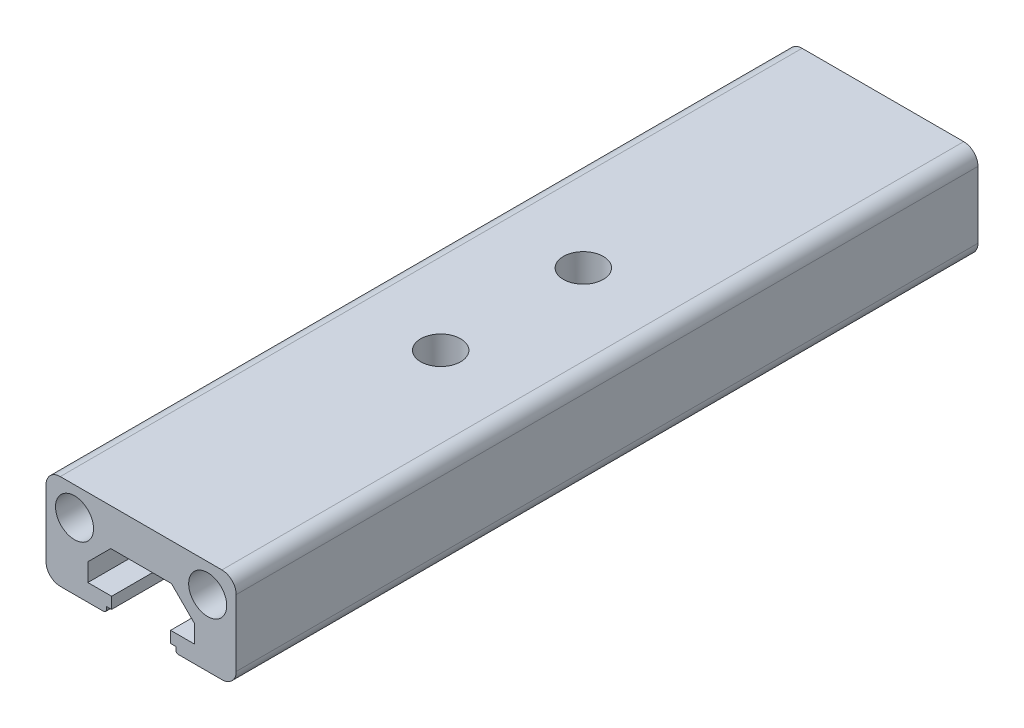
ISO-10303-21;
HEADER;
FILE_DESCRIPTION(('STEP AP214'),'2;1');
FILE_NAME('part.step','',(''),(''),'','','');
FILE_SCHEMA(('AUTOMOTIVE_DESIGN { 1 0 10303 214 1 1 1 1 }'));
ENDSEC;
DATA;
#1=APPLICATION_CONTEXT('core data for automotive mechanical design processes');
#2=APPLICATION_PROTOCOL_DEFINITION('international standard','automotive_design',2000,#1);
#3=PRODUCT_CONTEXT('',#1,'mechanical');
#4=PRODUCT('Part','Part','',(#3));
#5=PRODUCT_RELATED_PRODUCT_CATEGORY('part','',(#4));
#6=PRODUCT_DEFINITION_FORMATION('','',#4);
#7=PRODUCT_DEFINITION_CONTEXT('part definition',#1,'design');
#8=PRODUCT_DEFINITION('design','',#6,#7);
#9=PRODUCT_DEFINITION_SHAPE('','',#8);
#10=(LENGTH_UNIT() NAMED_UNIT(*) SI_UNIT(.MILLI.,.METRE.));
#11=(NAMED_UNIT(*) PLANE_ANGLE_UNIT() SI_UNIT($,.RADIAN.));
#12=(NAMED_UNIT(*) SI_UNIT($,.STERADIAN.) SOLID_ANGLE_UNIT());
#13=UNCERTAINTY_MEASURE_WITH_UNIT(LENGTH_MEASURE(1.E-05),#10,'distance_accuracy_value','');
#14=(GEOMETRIC_REPRESENTATION_CONTEXT(3) GLOBAL_UNCERTAINTY_ASSIGNED_CONTEXT((#13)) GLOBAL_UNIT_ASSIGNED_CONTEXT((#10,
#11,#12)) REPRESENTATION_CONTEXT('',''));
#15=CARTESIAN_POINT('',(0.,0.,0.));
#16=DIRECTION('',(0.,0.,1.));
#17=DIRECTION('',(1.,0.,0.));
#18=AXIS2_PLACEMENT_3D('',#15,#16,#17);
#19=CARTESIAN_POINT('',(3.95,0.3,39.));
#20=DIRECTION('',(0.,0.,1.));
#21=DIRECTION('',(1.,0.,0.));
#22=AXIS2_PLACEMENT_3D('',#19,#20,#21);
#23=PLANE('',#22);
#24=CARTESIAN_POINT('',(-7.,7.,39.));
#25=DIRECTION('',(0.,0.,1.));
#26=DIRECTION('',(1.,0.,0.));
#27=AXIS2_PLACEMENT_3D('',#24,#25,#26);
#28=CIRCLE('',#27,2.);
#29=CARTESIAN_POINT('',(-5.,7.,39.));
#30=VERTEX_POINT('',#29);
#31=EDGE_CURVE('E236',#30,#30,#28,.T.);
#32=ORIENTED_EDGE('',*,*,#31,.F.);
#33=EDGE_LOOP('',(#32));
#34=FACE_BOUND('',#33,.T.);
#35=DIRECTION('',(1.,0.,0.));
#36=VECTOR('',#35,1.);
#37=CARTESIAN_POINT('',(-3.65,0.6,39.));
#38=LINE('',#37,#36);
#39=CARTESIAN_POINT('',(-3.65,0.6,39.));
#40=VERTEX_POINT('',#39);
#41=CARTESIAN_POINT('',(-3.1,0.6,39.));
#42=VERTEX_POINT('',#41);
#43=EDGE_CURVE('E279',#40,#42,#38,.T.);
#44=ORIENTED_EDGE('',*,*,#43,.T.);
#45=DIRECTION('',(0.,1.,0.));
#46=VECTOR('',#45,1.);
#47=CARTESIAN_POINT('',(-3.1,0.6,39.));
#48=LINE('',#47,#46);
#49=CARTESIAN_POINT('',(-3.1,1.8,39.));
#50=VERTEX_POINT('',#49);
#51=EDGE_CURVE('E147',#42,#50,#48,.T.);
#52=ORIENTED_EDGE('',*,*,#51,.T.);
#53=DIRECTION('',(-1.,0.,0.));
#54=VECTOR('',#53,1.);
#55=CARTESIAN_POINT('',(-3.1,1.8,39.));
#56=LINE('',#55,#54);
#57=CARTESIAN_POINT('',(-5.6,1.8,39.));
#58=VERTEX_POINT('',#57);
#59=EDGE_CURVE('E365',#50,#58,#56,.T.);
#60=ORIENTED_EDGE('',*,*,#59,.T.);
#61=DIRECTION('',(0.,1.,0.));
#62=VECTOR('',#61,1.);
#63=CARTESIAN_POINT('',(-5.6,1.8,39.));
#64=LINE('',#63,#62);
#65=CARTESIAN_POINT('',(-5.6,3.69289321881342,39.));
#66=VERTEX_POINT('',#65);
#67=EDGE_CURVE('E367',#58,#66,#64,.T.);
#68=ORIENTED_EDGE('',*,*,#67,.T.);
#69=DIRECTION('',(0.707106781186543,0.707106781186552,0.));
#70=VECTOR('',#69,1.);
#71=CARTESIAN_POINT('',(-5.6,3.69289321881342,39.));
#72=LINE('',#71,#70);
#73=CARTESIAN_POINT('',(-3.19289321881345,6.1,39.));
#74=VERTEX_POINT('',#73);
#75=EDGE_CURVE('E369',#66,#74,#72,.T.);
#76=ORIENTED_EDGE('',*,*,#75,.T.);
#77=DIRECTION('',(1.,0.,0.));
#78=VECTOR('',#77,1.);
#79=CARTESIAN_POINT('',(-3.19289321881345,6.1,39.));
#80=LINE('',#79,#78);
#81=CARTESIAN_POINT('',(3.19289321881345,6.1,39.));
#82=VERTEX_POINT('',#81);
#83=EDGE_CURVE('E371',#74,#82,#80,.T.);
#84=ORIENTED_EDGE('',*,*,#83,.T.);
#85=DIRECTION('',(0.707106781186544,-0.707106781186551,0.));
#86=VECTOR('',#85,1.);
#87=CARTESIAN_POINT('',(5.6,3.69289321881343,39.));
#88=LINE('',#87,#86);
#89=CARTESIAN_POINT('',(5.6,3.69289321881343,39.));
#90=VERTEX_POINT('',#89);
#91=EDGE_CURVE('E373',#82,#90,#88,.T.);
#92=ORIENTED_EDGE('',*,*,#91,.T.);
#93=DIRECTION('',(0.,-1.,0.));
#94=VECTOR('',#93,1.);
#95=CARTESIAN_POINT('',(5.6,1.8,39.));
#96=LINE('',#95,#94);
#97=CARTESIAN_POINT('',(5.6,1.8,39.));
#98=VERTEX_POINT('',#97);
#99=EDGE_CURVE('E375',#90,#98,#96,.T.);
#100=ORIENTED_EDGE('',*,*,#99,.T.);
#101=DIRECTION('',(-1.,0.,0.));
#102=VECTOR('',#101,1.);
#103=CARTESIAN_POINT('',(3.1,1.8,39.));
#104=LINE('',#103,#102);
#105=CARTESIAN_POINT('',(3.1,1.8,39.));
#106=VERTEX_POINT('',#105);
#107=EDGE_CURVE('E377',#98,#106,#104,.T.);
#108=ORIENTED_EDGE('',*,*,#107,.T.);
#109=DIRECTION('',(0.,-1.,0.));
#110=VECTOR('',#109,1.);
#111=CARTESIAN_POINT('',(3.1,0.6,39.));
#112=LINE('',#111,#110);
#113=CARTESIAN_POINT('',(3.1,0.6,39.));
#114=VERTEX_POINT('',#113);
#115=EDGE_CURVE('E379',#106,#114,#112,.T.);
#116=ORIENTED_EDGE('',*,*,#115,.T.);
#117=DIRECTION('',(1.,0.,0.));
#118=VECTOR('',#117,1.);
#119=CARTESIAN_POINT('',(3.65,0.6,39.));
#120=LINE('',#119,#118);
#121=CARTESIAN_POINT('',(3.65,0.6,39.));
#122=VERTEX_POINT('',#121);
#123=EDGE_CURVE('E381',#114,#122,#120,.T.);
#124=ORIENTED_EDGE('',*,*,#123,.T.);
#125=DIRECTION('',(0.,-1.,0.));
#126=VECTOR('',#125,1.);
#127=CARTESIAN_POINT('',(3.65,0.300000000000002,39.));
#128=LINE('',#127,#126);
#129=CARTESIAN_POINT('',(3.65,0.300000000000002,39.));
#130=VERTEX_POINT('',#129);
#131=EDGE_CURVE('E383',#122,#130,#128,.T.);
#132=ORIENTED_EDGE('',*,*,#131,.T.);
#133=CARTESIAN_POINT('',(3.95,0.3,39.));
#134=DIRECTION('',(0.,0.,1.));
#135=DIRECTION('',(1.,0.,0.));
#136=AXIS2_PLACEMENT_3D('',#133,#134,#135);
#137=CIRCLE('',#136,0.3);
#138=CARTESIAN_POINT('',(3.95,0.,39.));
#139=VERTEX_POINT('',#138);
#140=EDGE_CURVE('E385',#130,#139,#137,.T.);
#141=ORIENTED_EDGE('',*,*,#140,.T.);
#142=DIRECTION('',(1.,0.,0.));
#143=VECTOR('',#142,1.);
#144=CARTESIAN_POINT('',(8.49999999999999,0.,39.));
#145=LINE('',#144,#143);
#146=CARTESIAN_POINT('',(8.49999999999999,0.,39.));
#147=VERTEX_POINT('',#146);
#148=EDGE_CURVE('E387',#139,#147,#145,.T.);
#149=ORIENTED_EDGE('',*,*,#148,.T.);
#150=CARTESIAN_POINT('',(8.5,1.5,39.));
#151=DIRECTION('',(0.,0.,1.));
#152=DIRECTION('',(1.,0.,0.));
#153=AXIS2_PLACEMENT_3D('',#150,#151,#152);
#154=CIRCLE('',#153,1.5);
#155=CARTESIAN_POINT('',(10.,1.50000000000001,39.));
#156=VERTEX_POINT('',#155);
#157=EDGE_CURVE('E389',#147,#156,#154,.T.);
#158=ORIENTED_EDGE('',*,*,#157,.T.);
#159=DIRECTION('',(0.,1.,0.));
#160=VECTOR('',#159,1.);
#161=CARTESIAN_POINT('',(10.,8.49999999999999,39.));
#162=LINE('',#161,#160);
#163=CARTESIAN_POINT('',(10.,8.49999999999999,39.));
#164=VERTEX_POINT('',#163);
#165=EDGE_CURVE('E391',#156,#164,#162,.T.);
#166=ORIENTED_EDGE('',*,*,#165,.T.);
#167=CARTESIAN_POINT('',(8.5,8.5,39.));
#168=DIRECTION('',(0.,0.,1.));
#169=DIRECTION('',(-1.,0.,0.));
#170=AXIS2_PLACEMENT_3D('',#167,#168,#169);
#171=CIRCLE('',#170,1.5);
#172=CARTESIAN_POINT('',(8.49999999999999,10.,39.));
#173=VERTEX_POINT('',#172);
#174=EDGE_CURVE('E393',#164,#173,#171,.T.);
#175=ORIENTED_EDGE('',*,*,#174,.T.);
#176=DIRECTION('',(-1.,0.,0.));
#177=VECTOR('',#176,1.);
#178=CARTESIAN_POINT('',(8.49999999999999,10.,39.));
#179=LINE('',#178,#177);
#180=CARTESIAN_POINT('',(-8.49999999999999,10.,39.));
#181=VERTEX_POINT('',#180);
#182=EDGE_CURVE('E395',#173,#181,#179,.T.);
#183=ORIENTED_EDGE('',*,*,#182,.T.);
#184=CARTESIAN_POINT('',(-8.5,8.5,39.));
#185=DIRECTION('',(0.,0.,1.));
#186=DIRECTION('',(1.,0.,0.));
#187=AXIS2_PLACEMENT_3D('',#184,#185,#186);
#188=CIRCLE('',#187,1.5);
#189=CARTESIAN_POINT('',(-10.,8.49999999999999,39.));
#190=VERTEX_POINT('',#189);
#191=EDGE_CURVE('E397',#181,#190,#188,.T.);
#192=ORIENTED_EDGE('',*,*,#191,.T.);
#193=DIRECTION('',(0.,-1.,0.));
#194=VECTOR('',#193,1.);
#195=CARTESIAN_POINT('',(-10.,8.49999999999999,39.));
#196=LINE('',#195,#194);
#197=CARTESIAN_POINT('',(-10.,1.5,39.));
#198=VERTEX_POINT('',#197);
#199=EDGE_CURVE('E399',#190,#198,#196,.T.);
#200=ORIENTED_EDGE('',*,*,#199,.T.);
#201=CARTESIAN_POINT('',(-8.5,1.5,39.));
#202=DIRECTION('',(0.,0.,1.));
#203=DIRECTION('',(-1.,0.,0.));
#204=AXIS2_PLACEMENT_3D('',#201,#202,#203);
#205=CIRCLE('',#204,1.5);
#206=CARTESIAN_POINT('',(-8.49999999999999,0.,39.));
#207=VERTEX_POINT('',#206);
#208=EDGE_CURVE('E214',#198,#207,#205,.T.);
#209=ORIENTED_EDGE('',*,*,#208,.T.);
#210=DIRECTION('',(1.,0.,0.));
#211=VECTOR('',#210,1.);
#212=CARTESIAN_POINT('',(-8.49999999999999,0.,39.));
#213=LINE('',#212,#211);
#214=CARTESIAN_POINT('',(-3.95,0.,39.));
#215=VERTEX_POINT('',#214);
#216=EDGE_CURVE('E208',#207,#215,#213,.T.);
#217=ORIENTED_EDGE('',*,*,#216,.T.);
#218=CARTESIAN_POINT('',(-3.95,0.3,39.));
#219=DIRECTION('',(0.,0.,1.));
#220=DIRECTION('',(1.,0.,0.));
#221=AXIS2_PLACEMENT_3D('',#218,#219,#220);
#222=CIRCLE('',#221,0.3);
#223=CARTESIAN_POINT('',(-3.65,0.300000000000002,39.));
#224=VERTEX_POINT('',#223);
#225=EDGE_CURVE('E212',#215,#224,#222,.T.);
#226=ORIENTED_EDGE('',*,*,#225,.T.);
#227=DIRECTION('',(0.,1.,0.));
#228=VECTOR('',#227,1.);
#229=CARTESIAN_POINT('',(-3.65,0.300000000000002,39.));
#230=LINE('',#229,#228);
#231=EDGE_CURVE('E56',#224,#40,#230,.T.);
#232=ORIENTED_EDGE('',*,*,#231,.T.);
#233=EDGE_LOOP('',(#44,#52,#60,#68,#76,#84,#92,#100,#108,#116,#124,#132,#141,#149,#158,#166,
#175,#183,#192,#200,#209,#217,#226,#232));
#234=FACE_BOUND('',#233,.T.);
#235=CARTESIAN_POINT('',(7.,7.,39.));
#236=DIRECTION('',(0.,0.,1.));
#237=DIRECTION('',(-1.,0.,0.));
#238=AXIS2_PLACEMENT_3D('',#235,#236,#237);
#239=CIRCLE('',#238,2.);
#240=CARTESIAN_POINT('',(5.,7.,39.));
#241=VERTEX_POINT('',#240);
#242=EDGE_CURVE('E353',#241,#241,#239,.T.);
#243=ORIENTED_EDGE('',*,*,#242,.F.);
#244=EDGE_LOOP('',(#243));
#245=FACE_BOUND('',#244,.T.);
#246=ADVANCED_FACE('F37',(#34,#234,#245),#23,.T.);
#247=CARTESIAN_POINT('',(3.95,0.3,-39.));
#248=DIRECTION('',(0.,0.,1.));
#249=DIRECTION('',(1.,0.,0.));
#250=AXIS2_PLACEMENT_3D('',#247,#248,#249);
#251=PLANE('',#250);
#252=DIRECTION('',(1.,0.,0.));
#253=VECTOR('',#252,1.);
#254=CARTESIAN_POINT('',(-3.65,0.6,-39.));
#255=LINE('',#254,#253);
#256=CARTESIAN_POINT('',(-3.65,0.6,-39.));
#257=VERTEX_POINT('',#256);
#258=CARTESIAN_POINT('',(-3.1,0.6,-39.));
#259=VERTEX_POINT('',#258);
#260=EDGE_CURVE('E232',#257,#259,#255,.T.);
#261=ORIENTED_EDGE('',*,*,#260,.F.);
#262=DIRECTION('',(0.,1.,0.));
#263=VECTOR('',#262,1.);
#264=CARTESIAN_POINT('',(-3.65,0.300000000000002,-39.));
#265=LINE('',#264,#263);
#266=CARTESIAN_POINT('',(-3.65,0.300000000000002,-39.));
#267=VERTEX_POINT('',#266);
#268=EDGE_CURVE('E139',#267,#257,#265,.T.);
#269=ORIENTED_EDGE('',*,*,#268,.F.);
#270=CARTESIAN_POINT('',(-3.95,0.3,-39.));
#271=DIRECTION('',(0.,0.,1.));
#272=DIRECTION('',(1.,0.,0.));
#273=AXIS2_PLACEMENT_3D('',#270,#271,#272);
#274=CIRCLE('',#273,0.3);
#275=CARTESIAN_POINT('',(-3.95,0.,-39.));
#276=VERTEX_POINT('',#275);
#277=EDGE_CURVE('E133',#276,#267,#274,.T.);
#278=ORIENTED_EDGE('',*,*,#277,.F.);
#279=DIRECTION('',(1.,0.,0.));
#280=VECTOR('',#279,1.);
#281=CARTESIAN_POINT('',(-8.49999999999999,0.,-39.));
#282=LINE('',#281,#280);
#283=CARTESIAN_POINT('',(-8.49999999999999,0.,-39.));
#284=VERTEX_POINT('',#283);
#285=EDGE_CURVE('E222',#284,#276,#282,.T.);
#286=ORIENTED_EDGE('',*,*,#285,.F.);
#287=CARTESIAN_POINT('',(-8.5,1.5,-39.));
#288=DIRECTION('',(0.,0.,1.));
#289=DIRECTION('',(-1.,0.,0.));
#290=AXIS2_PLACEMENT_3D('',#287,#288,#289);
#291=CIRCLE('',#290,1.5);
#292=CARTESIAN_POINT('',(-10.,1.5,-39.));
#293=VERTEX_POINT('',#292);
#294=EDGE_CURVE('E274',#293,#284,#291,.T.);
#295=ORIENTED_EDGE('',*,*,#294,.F.);
#296=DIRECTION('',(0.,-1.,0.));
#297=VECTOR('',#296,1.);
#298=CARTESIAN_POINT('',(-10.,8.49999999999999,-39.));
#299=LINE('',#298,#297);
#300=CARTESIAN_POINT('',(-10.,8.49999999999999,-39.));
#301=VERTEX_POINT('',#300);
#302=EDGE_CURVE('E272',#301,#293,#299,.T.);
#303=ORIENTED_EDGE('',*,*,#302,.F.);
#304=CARTESIAN_POINT('',(-8.5,8.5,-39.));
#305=DIRECTION('',(0.,0.,1.));
#306=DIRECTION('',(1.,0.,0.));
#307=AXIS2_PLACEMENT_3D('',#304,#305,#306);
#308=CIRCLE('',#307,1.5);
#309=CARTESIAN_POINT('',(-8.49999999999999,10.,-39.));
#310=VERTEX_POINT('',#309);
#311=EDGE_CURVE('E270',#310,#301,#308,.T.);
#312=ORIENTED_EDGE('',*,*,#311,.F.);
#313=DIRECTION('',(-1.,0.,0.));
#314=VECTOR('',#313,1.);
#315=CARTESIAN_POINT('',(8.49999999999999,10.,-39.));
#316=LINE('',#315,#314);
#317=CARTESIAN_POINT('',(8.49999999999999,10.,-39.));
#318=VERTEX_POINT('',#317);
#319=EDGE_CURVE('E268',#318,#310,#316,.T.);
#320=ORIENTED_EDGE('',*,*,#319,.F.);
#321=CARTESIAN_POINT('',(8.5,8.5,-39.));
#322=DIRECTION('',(0.,0.,1.));
#323=DIRECTION('',(-1.,0.,0.));
#324=AXIS2_PLACEMENT_3D('',#321,#322,#323);
#325=CIRCLE('',#324,1.5);
#326=CARTESIAN_POINT('',(10.,8.49999999999999,-39.));
#327=VERTEX_POINT('',#326);
#328=EDGE_CURVE('E266',#327,#318,#325,.T.);
#329=ORIENTED_EDGE('',*,*,#328,.F.);
#330=DIRECTION('',(0.,1.,0.));
#331=VECTOR('',#330,1.);
#332=CARTESIAN_POINT('',(10.,8.49999999999999,-39.));
#333=LINE('',#332,#331);
#334=CARTESIAN_POINT('',(10.,1.50000000000001,-39.));
#335=VERTEX_POINT('',#334);
#336=EDGE_CURVE('E264',#335,#327,#333,.T.);
#337=ORIENTED_EDGE('',*,*,#336,.F.);
#338=CARTESIAN_POINT('',(8.5,1.5,-39.));
#339=DIRECTION('',(0.,0.,1.));
#340=DIRECTION('',(1.,0.,0.));
#341=AXIS2_PLACEMENT_3D('',#338,#339,#340);
#342=CIRCLE('',#341,1.5);
#343=CARTESIAN_POINT('',(8.49999999999999,0.,-39.));
#344=VERTEX_POINT('',#343);
#345=EDGE_CURVE('E262',#344,#335,#342,.T.);
#346=ORIENTED_EDGE('',*,*,#345,.F.);
#347=DIRECTION('',(1.,0.,0.));
#348=VECTOR('',#347,1.);
#349=CARTESIAN_POINT('',(8.49999999999999,0.,-39.));
#350=LINE('',#349,#348);
#351=CARTESIAN_POINT('',(3.95,0.,-39.));
#352=VERTEX_POINT('',#351);
#353=EDGE_CURVE('E260',#352,#344,#350,.T.);
#354=ORIENTED_EDGE('',*,*,#353,.F.);
#355=CARTESIAN_POINT('',(3.95,0.3,-39.));
#356=DIRECTION('',(0.,0.,1.));
#357=DIRECTION('',(1.,0.,0.));
#358=AXIS2_PLACEMENT_3D('',#355,#356,#357);
#359=CIRCLE('',#358,0.3);
#360=CARTESIAN_POINT('',(3.65,0.300000000000002,-39.));
#361=VERTEX_POINT('',#360);
#362=EDGE_CURVE('E258',#361,#352,#359,.T.);
#363=ORIENTED_EDGE('',*,*,#362,.F.);
#364=DIRECTION('',(0.,-1.,0.));
#365=VECTOR('',#364,1.);
#366=CARTESIAN_POINT('',(3.65,0.300000000000002,-39.));
#367=LINE('',#366,#365);
#368=CARTESIAN_POINT('',(3.65,0.6,-39.));
#369=VERTEX_POINT('',#368);
#370=EDGE_CURVE('E256',#369,#361,#367,.T.);
#371=ORIENTED_EDGE('',*,*,#370,.F.);
#372=DIRECTION('',(1.,0.,0.));
#373=VECTOR('',#372,1.);
#374=CARTESIAN_POINT('',(3.65,0.6,-39.));
#375=LINE('',#374,#373);
#376=CARTESIAN_POINT('',(3.1,0.6,-39.));
#377=VERTEX_POINT('',#376);
#378=EDGE_CURVE('E254',#377,#369,#375,.T.);
#379=ORIENTED_EDGE('',*,*,#378,.F.);
#380=DIRECTION('',(0.,-1.,0.));
#381=VECTOR('',#380,1.);
#382=CARTESIAN_POINT('',(3.1,0.6,-39.));
#383=LINE('',#382,#381);
#384=CARTESIAN_POINT('',(3.1,1.8,-39.));
#385=VERTEX_POINT('',#384);
#386=EDGE_CURVE('E252',#385,#377,#383,.T.);
#387=ORIENTED_EDGE('',*,*,#386,.F.);
#388=DIRECTION('',(-1.,0.,0.));
#389=VECTOR('',#388,1.);
#390=CARTESIAN_POINT('',(3.1,1.8,-39.));
#391=LINE('',#390,#389);
#392=CARTESIAN_POINT('',(5.6,1.8,-39.));
#393=VERTEX_POINT('',#392);
#394=EDGE_CURVE('E250',#393,#385,#391,.T.);
#395=ORIENTED_EDGE('',*,*,#394,.F.);
#396=DIRECTION('',(0.,-1.,0.));
#397=VECTOR('',#396,1.);
#398=CARTESIAN_POINT('',(5.6,1.8,-39.));
#399=LINE('',#398,#397);
#400=CARTESIAN_POINT('',(5.6,3.69289321881343,-39.));
#401=VERTEX_POINT('',#400);
#402=EDGE_CURVE('E248',#401,#393,#399,.T.);
#403=ORIENTED_EDGE('',*,*,#402,.F.);
#404=DIRECTION('',(0.707106781186544,-0.707106781186551,0.));
#405=VECTOR('',#404,1.);
#406=CARTESIAN_POINT('',(5.6,3.69289321881343,-39.));
#407=LINE('',#406,#405);
#408=CARTESIAN_POINT('',(3.19289321881345,6.1,-39.));
#409=VERTEX_POINT('',#408);
#410=EDGE_CURVE('E246',#409,#401,#407,.T.);
#411=ORIENTED_EDGE('',*,*,#410,.F.);
#412=DIRECTION('',(1.,0.,0.));
#413=VECTOR('',#412,1.);
#414=CARTESIAN_POINT('',(-3.19289321881345,6.1,-39.));
#415=LINE('',#414,#413);
#416=CARTESIAN_POINT('',(-3.19289321881345,6.1,-39.));
#417=VERTEX_POINT('',#416);
#418=EDGE_CURVE('E244',#417,#409,#415,.T.);
#419=ORIENTED_EDGE('',*,*,#418,.F.);
#420=DIRECTION('',(0.707106781186543,0.707106781186552,0.));
#421=VECTOR('',#420,1.);
#422=CARTESIAN_POINT('',(-5.6,3.69289321881342,-39.));
#423=LINE('',#422,#421);
#424=CARTESIAN_POINT('',(-5.6,3.69289321881342,-39.));
#425=VERTEX_POINT('',#424);
#426=EDGE_CURVE('E242',#425,#417,#423,.T.);
#427=ORIENTED_EDGE('',*,*,#426,.F.);
#428=DIRECTION('',(0.,1.,0.));
#429=VECTOR('',#428,1.);
#430=CARTESIAN_POINT('',(-5.6,1.8,-39.));
#431=LINE('',#430,#429);
#432=CARTESIAN_POINT('',(-5.6,1.8,-39.));
#433=VERTEX_POINT('',#432);
#434=EDGE_CURVE('E240',#433,#425,#431,.T.);
#435=ORIENTED_EDGE('',*,*,#434,.F.);
#436=DIRECTION('',(-1.,0.,0.));
#437=VECTOR('',#436,1.);
#438=CARTESIAN_POINT('',(-3.1,1.8,-39.));
#439=LINE('',#438,#437);
#440=CARTESIAN_POINT('',(-3.1,1.8,-39.));
#441=VERTEX_POINT('',#440);
#442=EDGE_CURVE('E238',#441,#433,#439,.T.);
#443=ORIENTED_EDGE('',*,*,#442,.F.);
#444=DIRECTION('',(0.,1.,0.));
#445=VECTOR('',#444,1.);
#446=CARTESIAN_POINT('',(-3.1,0.6,-39.));
#447=LINE('',#446,#445);
#448=EDGE_CURVE('E235',#259,#441,#447,.T.);
#449=ORIENTED_EDGE('',*,*,#448,.F.);
#450=EDGE_LOOP('',(#261,#269,#278,#286,#295,#303,#312,#320,#329,#337,#346,#354,#363,#371,#379,
#387,#395,#403,#411,#419,#427,#435,#443,#449));
#451=FACE_BOUND('',#450,.T.);
#452=CARTESIAN_POINT('',(-7.,7.,-39.));
#453=DIRECTION('',(0.,0.,1.));
#454=DIRECTION('',(1.,0.,0.));
#455=AXIS2_PLACEMENT_3D('',#452,#453,#454);
#456=CIRCLE('',#455,2.);
#457=CARTESIAN_POINT('',(-5.,7.,-39.));
#458=VERTEX_POINT('',#457);
#459=EDGE_CURVE('E356',#458,#458,#456,.T.);
#460=ORIENTED_EDGE('',*,*,#459,.T.);
#461=EDGE_LOOP('',(#460));
#462=FACE_BOUND('',#461,.T.);
#463=CARTESIAN_POINT('',(7.,7.,-39.));
#464=DIRECTION('',(0.,0.,1.));
#465=DIRECTION('',(-1.,0.,0.));
#466=AXIS2_PLACEMENT_3D('',#463,#464,#465);
#467=CIRCLE('',#466,2.);
#468=CARTESIAN_POINT('',(5.,7.,-39.));
#469=VERTEX_POINT('',#468);
#470=EDGE_CURVE('E352',#469,#469,#467,.T.);
#471=ORIENTED_EDGE('',*,*,#470,.T.);
#472=EDGE_LOOP('',(#471));
#473=FACE_BOUND('',#472,.T.);
#474=ADVANCED_FACE('F412',(#451,#462,#473),#251,.F.);
#475=CARTESIAN_POINT('',(-3.65,0.6,39.));
#476=DIRECTION('',(0.,1.,0.));
#477=DIRECTION('',(0.,0.,1.));
#478=AXIS2_PLACEMENT_3D('',#475,#476,#477);
#479=PLANE('',#478);
#480=ORIENTED_EDGE('',*,*,#260,.T.);
#481=DIRECTION('',(0.,0.,-1.));
#482=VECTOR('',#481,1.);
#483=CARTESIAN_POINT('',(-3.1,0.6,39.));
#484=LINE('',#483,#482);
#485=EDGE_CURVE('E11',#42,#259,#484,.T.);
#486=ORIENTED_EDGE('',*,*,#485,.F.);
#487=ORIENTED_EDGE('',*,*,#43,.F.);
#488=DIRECTION('',(0.,0.,-1.));
#489=VECTOR('',#488,1.);
#490=CARTESIAN_POINT('',(-3.65,0.6,39.));
#491=LINE('',#490,#489);
#492=EDGE_CURVE('E228',#40,#257,#491,.T.);
#493=ORIENTED_EDGE('',*,*,#492,.T.);
#494=EDGE_LOOP('',(#480,#486,#487,#493));
#495=FACE_BOUND('',#494,.T.);
#496=ADVANCED_FACE('F39',(#495),#479,.F.);
#497=CARTESIAN_POINT('',(-3.1,0.6,39.));
#498=DIRECTION('',(-1.,0.,0.));
#499=DIRECTION('',(0.,0.,1.));
#500=AXIS2_PLACEMENT_3D('',#497,#498,#499);
#501=PLANE('',#500);
#502=ORIENTED_EDGE('',*,*,#448,.T.);
#503=DIRECTION('',(0.,0.,-1.));
#504=VECTOR('',#503,1.);
#505=CARTESIAN_POINT('',(-3.1,1.8,39.));
#506=LINE('',#505,#504);
#507=EDGE_CURVE('E47',#50,#441,#506,.T.);
#508=ORIENTED_EDGE('',*,*,#507,.F.);
#509=ORIENTED_EDGE('',*,*,#51,.F.);
#510=ORIENTED_EDGE('',*,*,#485,.T.);
#511=EDGE_LOOP('',(#502,#508,#509,#510));
#512=FACE_BOUND('',#511,.T.);
#513=ADVANCED_FACE('F494',(#512),#501,.F.);
#514=CARTESIAN_POINT('',(-3.1,1.8,39.));
#515=DIRECTION('',(0.,-1.,0.));
#516=DIRECTION('',(1.,0.,0.));
#517=AXIS2_PLACEMENT_3D('',#514,#515,#516);
#518=PLANE('',#517);
#519=ORIENTED_EDGE('',*,*,#442,.T.);
#520=DIRECTION('',(0.,0.,-1.));
#521=VECTOR('',#520,1.);
#522=CARTESIAN_POINT('',(-5.6,1.8,39.));
#523=LINE('',#522,#521);
#524=EDGE_CURVE('E334',#58,#433,#523,.T.);
#525=ORIENTED_EDGE('',*,*,#524,.F.);
#526=ORIENTED_EDGE('',*,*,#59,.F.);
#527=ORIENTED_EDGE('',*,*,#507,.T.);
#528=EDGE_LOOP('',(#519,#525,#526,#527));
#529=FACE_BOUND('',#528,.T.);
#530=ADVANCED_FACE('F493',(#529),#518,.F.);
#531=CARTESIAN_POINT('',(-5.6,1.8,39.));
#532=DIRECTION('',(-1.,0.,0.));
#533=DIRECTION('',(0.,-1.,0.));
#534=AXIS2_PLACEMENT_3D('',#531,#532,#533);
#535=PLANE('',#534);
#536=ORIENTED_EDGE('',*,*,#434,.T.);
#537=DIRECTION('',(0.,0.,-1.));
#538=VECTOR('',#537,1.);
#539=CARTESIAN_POINT('',(-5.6,3.69289321881342,39.));
#540=LINE('',#539,#538);
#541=EDGE_CURVE('E331',#66,#425,#540,.T.);
#542=ORIENTED_EDGE('',*,*,#541,.F.);
#543=ORIENTED_EDGE('',*,*,#67,.F.);
#544=ORIENTED_EDGE('',*,*,#524,.T.);
#545=EDGE_LOOP('',(#536,#542,#543,#544));
#546=FACE_BOUND('',#545,.T.);
#547=ADVANCED_FACE('F489',(#546),#535,.F.);
#548=CARTESIAN_POINT('',(-5.6,3.69289321881342,39.));
#549=DIRECTION('',(-0.707106781186552,0.707106781186543,0.));
#550=DIRECTION('',(-0.707106781186543,-0.707106781186552,0.));
#551=AXIS2_PLACEMENT_3D('',#548,#549,#550);
#552=PLANE('',#551);
#553=ORIENTED_EDGE('',*,*,#426,.T.);
#554=DIRECTION('',(0.,0.,-1.));
#555=VECTOR('',#554,1.);
#556=CARTESIAN_POINT('',(-3.19289321881345,6.1,39.));
#557=LINE('',#556,#555);
#558=EDGE_CURVE('E328',#74,#417,#557,.T.);
#559=ORIENTED_EDGE('',*,*,#558,.F.);
#560=ORIENTED_EDGE('',*,*,#75,.F.);
#561=ORIENTED_EDGE('',*,*,#541,.T.);
#562=EDGE_LOOP('',(#553,#559,#560,#561));
#563=FACE_BOUND('',#562,.T.);
#564=ADVANCED_FACE('F458',(#563),#552,.F.);
#565=CARTESIAN_POINT('',(-3.19289321881345,6.1,39.));
#566=DIRECTION('',(0.,1.,0.));
#567=DIRECTION('',(0.,0.,1.));
#568=AXIS2_PLACEMENT_3D('',#565,#566,#567);
#569=PLANE('',#568);
#570=CARTESIAN_POINT('',(0.,6.1,-7.5));
#571=DIRECTION('',(0.,1.,0.));
#572=DIRECTION('',(0.,0.,1.));
#573=AXIS2_PLACEMENT_3D('',#570,#571,#572);
#574=CIRCLE('',#573,2.1);
#575=CARTESIAN_POINT('',(0.,6.1,-5.4));
#576=VERTEX_POINT('',#575);
#577=EDGE_CURVE('E348',#576,#576,#574,.T.);
#578=ORIENTED_EDGE('',*,*,#577,.T.);
#579=EDGE_LOOP('',(#578));
#580=FACE_BOUND('',#579,.T.);
#581=CARTESIAN_POINT('',(0.,6.1,7.5));
#582=DIRECTION('',(0.,1.,0.));
#583=DIRECTION('',(0.,0.,1.));
#584=AXIS2_PLACEMENT_3D('',#581,#582,#583);
#585=CIRCLE('',#584,2.1);
#586=CARTESIAN_POINT('',(0.,6.1,9.6));
#587=VERTEX_POINT('',#586);
#588=EDGE_CURVE('E340',#587,#587,#585,.T.);
#589=ORIENTED_EDGE('',*,*,#588,.T.);
#590=EDGE_LOOP('',(#589));
#591=FACE_BOUND('',#590,.T.);
#592=ORIENTED_EDGE('',*,*,#418,.T.);
#593=DIRECTION('',(0.,0.,-1.));
#594=VECTOR('',#593,1.);
#595=CARTESIAN_POINT('',(3.19289321881345,6.1,39.));
#596=LINE('',#595,#594);
#597=EDGE_CURVE('E325',#82,#409,#596,.T.);
#598=ORIENTED_EDGE('',*,*,#597,.F.);
#599=ORIENTED_EDGE('',*,*,#83,.F.);
#600=ORIENTED_EDGE('',*,*,#558,.T.);
#601=EDGE_LOOP('',(#592,#598,#599,#600));
#602=FACE_BOUND('',#601,.T.);
#603=ADVANCED_FACE('F455',(#580,#591,#602),#569,.F.);
#604=CARTESIAN_POINT('',(5.6,3.69289321881343,39.));
#605=DIRECTION('',(0.707106781186551,0.707106781186544,0.));
#606=DIRECTION('',(-0.707106781186544,0.707106781186551,0.));
#607=AXIS2_PLACEMENT_3D('',#604,#605,#606);
#608=PLANE('',#607);
#609=ORIENTED_EDGE('',*,*,#410,.T.);
#610=DIRECTION('',(0.,0.,-1.));
#611=VECTOR('',#610,1.);
#612=CARTESIAN_POINT('',(5.6,3.69289321881343,39.));
#613=LINE('',#612,#611);
#614=EDGE_CURVE('E322',#90,#401,#613,.T.);
#615=ORIENTED_EDGE('',*,*,#614,.F.);
#616=ORIENTED_EDGE('',*,*,#91,.F.);
#617=ORIENTED_EDGE('',*,*,#597,.T.);
#618=EDGE_LOOP('',(#609,#615,#616,#617));
#619=FACE_BOUND('',#618,.T.);
#620=ADVANCED_FACE('F457',(#619),#608,.F.);
#621=CARTESIAN_POINT('',(5.6,1.8,39.));
#622=DIRECTION('',(1.,0.,0.));
#623=DIRECTION('',(0.,1.,0.));
#624=AXIS2_PLACEMENT_3D('',#621,#622,#623);
#625=PLANE('',#624);
#626=ORIENTED_EDGE('',*,*,#402,.T.);
#627=DIRECTION('',(0.,0.,-1.));
#628=VECTOR('',#627,1.);
#629=CARTESIAN_POINT('',(5.6,1.8,39.));
#630=LINE('',#629,#628);
#631=EDGE_CURVE('E319',#98,#393,#630,.T.);
#632=ORIENTED_EDGE('',*,*,#631,.F.);
#633=ORIENTED_EDGE('',*,*,#99,.F.);
#634=ORIENTED_EDGE('',*,*,#614,.T.);
#635=EDGE_LOOP('',(#626,#632,#633,#634));
#636=FACE_BOUND('',#635,.T.);
#637=ADVANCED_FACE('F475',(#636),#625,.F.);
#638=CARTESIAN_POINT('',(3.1,1.8,39.));
#639=DIRECTION('',(0.,-1.,0.));
#640=DIRECTION('',(1.,0.,0.));
#641=AXIS2_PLACEMENT_3D('',#638,#639,#640);
#642=PLANE('',#641);
#643=ORIENTED_EDGE('',*,*,#394,.T.);
#644=DIRECTION('',(0.,0.,-1.));
#645=VECTOR('',#644,1.);
#646=CARTESIAN_POINT('',(3.1,1.8,39.));
#647=LINE('',#646,#645);
#648=EDGE_CURVE('E316',#106,#385,#647,.T.);
#649=ORIENTED_EDGE('',*,*,#648,.F.);
#650=ORIENTED_EDGE('',*,*,#107,.F.);
#651=ORIENTED_EDGE('',*,*,#631,.T.);
#652=EDGE_LOOP('',(#643,#649,#650,#651));
#653=FACE_BOUND('',#652,.T.);
#654=ADVANCED_FACE('F479',(#653),#642,.F.);
#655=CARTESIAN_POINT('',(3.1,0.6,39.));
#656=DIRECTION('',(1.,0.,0.));
#657=DIRECTION('',(0.,0.,-1.));
#658=AXIS2_PLACEMENT_3D('',#655,#656,#657);
#659=PLANE('',#658);
#660=ORIENTED_EDGE('',*,*,#386,.T.);
#661=DIRECTION('',(0.,0.,-1.));
#662=VECTOR('',#661,1.);
#663=CARTESIAN_POINT('',(3.1,0.6,39.));
#664=LINE('',#663,#662);
#665=EDGE_CURVE('E313',#114,#377,#664,.T.);
#666=ORIENTED_EDGE('',*,*,#665,.F.);
#667=ORIENTED_EDGE('',*,*,#115,.F.);
#668=ORIENTED_EDGE('',*,*,#648,.T.);
#669=EDGE_LOOP('',(#660,#666,#667,#668));
#670=FACE_BOUND('',#669,.T.);
#671=ADVANCED_FACE('F512',(#670),#659,.F.);
#672=CARTESIAN_POINT('',(3.65,0.6,39.));
#673=DIRECTION('',(0.,1.,0.));
#674=DIRECTION('',(0.,0.,1.));
#675=AXIS2_PLACEMENT_3D('',#672,#673,#674);
#676=PLANE('',#675);
#677=ORIENTED_EDGE('',*,*,#378,.T.);
#678=DIRECTION('',(0.,0.,-1.));
#679=VECTOR('',#678,1.);
#680=CARTESIAN_POINT('',(3.65,0.6,39.));
#681=LINE('',#680,#679);
#682=EDGE_CURVE('E310',#122,#369,#681,.T.);
#683=ORIENTED_EDGE('',*,*,#682,.F.);
#684=ORIENTED_EDGE('',*,*,#123,.F.);
#685=ORIENTED_EDGE('',*,*,#665,.T.);
#686=EDGE_LOOP('',(#677,#683,#684,#685));
#687=FACE_BOUND('',#686,.T.);
#688=ADVANCED_FACE('F515',(#687),#676,.F.);
#689=CARTESIAN_POINT('',(3.65,0.300000000000002,39.));
#690=DIRECTION('',(1.,0.,0.));
#691=DIRECTION('',(0.,0.,-1.));
#692=AXIS2_PLACEMENT_3D('',#689,#690,#691);
#693=PLANE('',#692);
#694=ORIENTED_EDGE('',*,*,#370,.T.);
#695=DIRECTION('',(0.,0.,-1.));
#696=VECTOR('',#695,1.);
#697=CARTESIAN_POINT('',(3.65,0.300000000000002,39.));
#698=LINE('',#697,#696);
#699=EDGE_CURVE('E307',#130,#361,#698,.T.);
#700=ORIENTED_EDGE('',*,*,#699,.F.);
#701=ORIENTED_EDGE('',*,*,#131,.F.);
#702=ORIENTED_EDGE('',*,*,#682,.T.);
#703=EDGE_LOOP('',(#694,#700,#701,#702));
#704=FACE_BOUND('',#703,.T.);
#705=ADVANCED_FACE('F519',(#704),#693,.F.);
#706=CARTESIAN_POINT('',(3.95,0.3,39.));
#707=DIRECTION('',(0.,0.,-1.));
#708=DIRECTION('',(-1.,0.,0.));
#709=AXIS2_PLACEMENT_3D('',#706,#707,#708);
#710=CYLINDRICAL_SURFACE('',#709,0.3);
#711=ORIENTED_EDGE('',*,*,#362,.T.);
#712=DIRECTION('',(0.,0.,-1.));
#713=VECTOR('',#712,1.);
#714=CARTESIAN_POINT('',(3.95,0.,39.));
#715=LINE('',#714,#713);
#716=EDGE_CURVE('E304',#139,#352,#715,.T.);
#717=ORIENTED_EDGE('',*,*,#716,.F.);
#718=ORIENTED_EDGE('',*,*,#140,.F.);
#719=ORIENTED_EDGE('',*,*,#699,.T.);
#720=EDGE_LOOP('',(#711,#717,#718,#719));
#721=FACE_BOUND('',#720,.T.);
#722=ADVANCED_FACE('F523',(#721),#710,.T.);
#723=CARTESIAN_POINT('',(8.49999999999999,0.,39.));
#724=DIRECTION('',(0.,1.,0.));
#725=DIRECTION('',(0.,0.,1.));
#726=AXIS2_PLACEMENT_3D('',#723,#724,#725);
#727=PLANE('',#726);
#728=ORIENTED_EDGE('',*,*,#353,.T.);
#729=DIRECTION('',(0.,0.,-1.));
#730=VECTOR('',#729,1.);
#731=CARTESIAN_POINT('',(8.49999999999999,0.,39.));
#732=LINE('',#731,#730);
#733=EDGE_CURVE('E301',#147,#344,#732,.T.);
#734=ORIENTED_EDGE('',*,*,#733,.F.);
#735=ORIENTED_EDGE('',*,*,#148,.F.);
#736=ORIENTED_EDGE('',*,*,#716,.T.);
#737=EDGE_LOOP('',(#728,#734,#735,#736));
#738=FACE_BOUND('',#737,.T.);
#739=ADVANCED_FACE('F527',(#738),#727,.F.);
#740=CARTESIAN_POINT('',(8.5,1.5,39.));
#741=DIRECTION('',(0.,0.,-1.));
#742=DIRECTION('',(-1.,0.,0.));
#743=AXIS2_PLACEMENT_3D('',#740,#741,#742);
#744=CYLINDRICAL_SURFACE('',#743,1.5);
#745=ORIENTED_EDGE('',*,*,#345,.T.);
#746=DIRECTION('',(0.,0.,-1.));
#747=VECTOR('',#746,1.);
#748=CARTESIAN_POINT('',(10.,1.50000000000001,39.));
#749=LINE('',#748,#747);
#750=EDGE_CURVE('E298',#156,#335,#749,.T.);
#751=ORIENTED_EDGE('',*,*,#750,.F.);
#752=ORIENTED_EDGE('',*,*,#157,.F.);
#753=ORIENTED_EDGE('',*,*,#733,.T.);
#754=EDGE_LOOP('',(#745,#751,#752,#753));
#755=FACE_BOUND('',#754,.T.);
#756=ADVANCED_FACE('F531',(#755),#744,.T.);
#757=CARTESIAN_POINT('',(10.,8.49999999999999,39.));
#758=DIRECTION('',(-1.,0.,0.));
#759=DIRECTION('',(0.,0.,1.));
#760=AXIS2_PLACEMENT_3D('',#757,#758,#759);
#761=PLANE('',#760);
#762=ORIENTED_EDGE('',*,*,#336,.T.);
#763=DIRECTION('',(0.,0.,-1.));
#764=VECTOR('',#763,1.);
#765=CARTESIAN_POINT('',(10.,8.49999999999999,39.));
#766=LINE('',#765,#764);
#767=EDGE_CURVE('E295',#164,#327,#766,.T.);
#768=ORIENTED_EDGE('',*,*,#767,.F.);
#769=ORIENTED_EDGE('',*,*,#165,.F.);
#770=ORIENTED_EDGE('',*,*,#750,.T.);
#771=EDGE_LOOP('',(#762,#768,#769,#770));
#772=FACE_BOUND('',#771,.T.);
#773=ADVANCED_FACE('F535',(#772),#761,.F.);
#774=CARTESIAN_POINT('',(8.5,8.5,39.));
#775=DIRECTION('',(0.,0.,-1.));
#776=DIRECTION('',(-1.,0.,0.));
#777=AXIS2_PLACEMENT_3D('',#774,#775,#776);
#778=CYLINDRICAL_SURFACE('',#777,1.5);
#779=ORIENTED_EDGE('',*,*,#328,.T.);
#780=DIRECTION('',(0.,0.,-1.));
#781=VECTOR('',#780,1.);
#782=CARTESIAN_POINT('',(8.49999999999999,10.,39.));
#783=LINE('',#782,#781);
#784=EDGE_CURVE('E292',#173,#318,#783,.T.);
#785=ORIENTED_EDGE('',*,*,#784,.F.);
#786=ORIENTED_EDGE('',*,*,#174,.F.);
#787=ORIENTED_EDGE('',*,*,#767,.T.);
#788=EDGE_LOOP('',(#779,#785,#786,#787));
#789=FACE_BOUND('',#788,.T.);
#790=ADVANCED_FACE('F539',(#789),#778,.T.);
#791=CARTESIAN_POINT('',(8.49999999999999,10.,39.));
#792=DIRECTION('',(0.,-1.,0.));
#793=DIRECTION('',(0.,0.,-1.));
#794=AXIS2_PLACEMENT_3D('',#791,#792,#793);
#795=PLANE('',#794);
#796=CARTESIAN_POINT('',(0.,10.,-7.5));
#797=DIRECTION('',(0.,-1.,0.));
#798=DIRECTION('',(0.,0.,-1.));
#799=AXIS2_PLACEMENT_3D('',#796,#797,#798);
#800=CIRCLE('',#799,2.1);
#801=CARTESIAN_POINT('',(0.,10.,-9.6));
#802=VERTEX_POINT('',#801);
#803=EDGE_CURVE('E41',#802,#802,#800,.T.);
#804=ORIENTED_EDGE('',*,*,#803,.T.);
#805=EDGE_LOOP('',(#804));
#806=FACE_BOUND('',#805,.T.);
#807=CARTESIAN_POINT('',(0.,10.,7.5));
#808=DIRECTION('',(0.,-1.,0.));
#809=DIRECTION('',(0.,0.,-1.));
#810=AXIS2_PLACEMENT_3D('',#807,#808,#809);
#811=CIRCLE('',#810,2.1);
#812=CARTESIAN_POINT('',(0.,10.,5.4));
#813=VERTEX_POINT('',#812);
#814=EDGE_CURVE('E338',#813,#813,#811,.T.);
#815=ORIENTED_EDGE('',*,*,#814,.T.);
#816=EDGE_LOOP('',(#815));
#817=FACE_BOUND('',#816,.T.);
#818=ORIENTED_EDGE('',*,*,#319,.T.);
#819=DIRECTION('',(0.,0.,-1.));
#820=VECTOR('',#819,1.);
#821=CARTESIAN_POINT('',(-8.49999999999999,10.,39.));
#822=LINE('',#821,#820);
#823=EDGE_CURVE('E289',#181,#310,#822,.T.);
#824=ORIENTED_EDGE('',*,*,#823,.F.);
#825=ORIENTED_EDGE('',*,*,#182,.F.);
#826=ORIENTED_EDGE('',*,*,#784,.T.);
#827=EDGE_LOOP('',(#818,#824,#825,#826));
#828=FACE_BOUND('',#827,.T.);
#829=ADVANCED_FACE('F543',(#806,#817,#828),#795,.F.);
#830=CARTESIAN_POINT('',(-8.5,8.5,39.));
#831=DIRECTION('',(0.,0.,-1.));
#832=DIRECTION('',(-1.,0.,0.));
#833=AXIS2_PLACEMENT_3D('',#830,#831,#832);
#834=CYLINDRICAL_SURFACE('',#833,1.5);
#835=ORIENTED_EDGE('',*,*,#311,.T.);
#836=DIRECTION('',(0.,0.,-1.));
#837=VECTOR('',#836,1.);
#838=CARTESIAN_POINT('',(-10.,8.49999999999999,39.));
#839=LINE('',#838,#837);
#840=EDGE_CURVE('E286',#190,#301,#839,.T.);
#841=ORIENTED_EDGE('',*,*,#840,.F.);
#842=ORIENTED_EDGE('',*,*,#191,.F.);
#843=ORIENTED_EDGE('',*,*,#823,.T.);
#844=EDGE_LOOP('',(#835,#841,#842,#843));
#845=FACE_BOUND('',#844,.T.);
#846=ADVANCED_FACE('F547',(#845),#834,.T.);
#847=CARTESIAN_POINT('',(-10.,8.49999999999999,39.));
#848=DIRECTION('',(1.,0.,0.));
#849=DIRECTION('',(0.,0.,-1.));
#850=AXIS2_PLACEMENT_3D('',#847,#848,#849);
#851=PLANE('',#850);
#852=ORIENTED_EDGE('',*,*,#302,.T.);
#853=DIRECTION('',(0.,0.,-1.));
#854=VECTOR('',#853,1.);
#855=CARTESIAN_POINT('',(-10.,1.5,39.));
#856=LINE('',#855,#854);
#857=EDGE_CURVE('E283',#198,#293,#856,.T.);
#858=ORIENTED_EDGE('',*,*,#857,.F.);
#859=ORIENTED_EDGE('',*,*,#199,.F.);
#860=ORIENTED_EDGE('',*,*,#840,.T.);
#861=EDGE_LOOP('',(#852,#858,#859,#860));
#862=FACE_BOUND('',#861,.T.);
#863=ADVANCED_FACE('F405',(#862),#851,.F.);
#864=CARTESIAN_POINT('',(-8.5,1.5,39.));
#865=DIRECTION('',(0.,0.,-1.));
#866=DIRECTION('',(-1.,0.,0.));
#867=AXIS2_PLACEMENT_3D('',#864,#865,#866);
#868=CYLINDRICAL_SURFACE('',#867,1.5);
#869=ORIENTED_EDGE('',*,*,#294,.T.);
#870=DIRECTION('',(0.,0.,-1.));
#871=VECTOR('',#870,1.);
#872=CARTESIAN_POINT('',(-8.49999999999999,0.,39.));
#873=LINE('',#872,#871);
#874=EDGE_CURVE('E223',#207,#284,#873,.T.);
#875=ORIENTED_EDGE('',*,*,#874,.F.);
#876=ORIENTED_EDGE('',*,*,#208,.F.);
#877=ORIENTED_EDGE('',*,*,#857,.T.);
#878=EDGE_LOOP('',(#869,#875,#876,#877));
#879=FACE_BOUND('',#878,.T.);
#880=ADVANCED_FACE('F409',(#879),#868,.T.);
#881=CARTESIAN_POINT('',(-8.49999999999999,0.,39.));
#882=DIRECTION('',(0.,1.,0.));
#883=DIRECTION('',(0.,0.,1.));
#884=AXIS2_PLACEMENT_3D('',#881,#882,#883);
#885=PLANE('',#884);
#886=ORIENTED_EDGE('',*,*,#285,.T.);
#887=DIRECTION('',(0.,0.,-1.));
#888=VECTOR('',#887,1.);
#889=CARTESIAN_POINT('',(-3.95,0.,39.));
#890=LINE('',#889,#888);
#891=EDGE_CURVE('E219',#215,#276,#890,.T.);
#892=ORIENTED_EDGE('',*,*,#891,.F.);
#893=ORIENTED_EDGE('',*,*,#216,.F.);
#894=ORIENTED_EDGE('',*,*,#874,.T.);
#895=EDGE_LOOP('',(#886,#892,#893,#894));
#896=FACE_BOUND('',#895,.T.);
#897=ADVANCED_FACE('F220',(#896),#885,.F.);
#898=CARTESIAN_POINT('',(-3.95,0.3,39.));
#899=DIRECTION('',(0.,0.,-1.));
#900=DIRECTION('',(-1.,0.,0.));
#901=AXIS2_PLACEMENT_3D('',#898,#899,#900);
#902=CYLINDRICAL_SURFACE('',#901,0.3);
#903=ORIENTED_EDGE('',*,*,#277,.T.);
#904=DIRECTION('',(0.,0.,-1.));
#905=VECTOR('',#904,1.);
#906=CARTESIAN_POINT('',(-3.65,0.300000000000002,39.));
#907=LINE('',#906,#905);
#908=EDGE_CURVE('E224',#224,#267,#907,.T.);
#909=ORIENTED_EDGE('',*,*,#908,.F.);
#910=ORIENTED_EDGE('',*,*,#225,.F.);
#911=ORIENTED_EDGE('',*,*,#891,.T.);
#912=EDGE_LOOP('',(#903,#909,#910,#911));
#913=FACE_BOUND('',#912,.T.);
#914=ADVANCED_FACE('F226',(#913),#902,.T.);
#915=CARTESIAN_POINT('',(-3.65,0.300000000000002,39.));
#916=DIRECTION('',(-1.,0.,0.));
#917=DIRECTION('',(0.,0.,1.));
#918=AXIS2_PLACEMENT_3D('',#915,#916,#917);
#919=PLANE('',#918);
#920=ORIENTED_EDGE('',*,*,#268,.T.);
#921=ORIENTED_EDGE('',*,*,#492,.F.);
#922=ORIENTED_EDGE('',*,*,#231,.F.);
#923=ORIENTED_EDGE('',*,*,#908,.T.);
#924=EDGE_LOOP('',(#920,#921,#922,#923));
#925=FACE_BOUND('',#924,.T.);
#926=ADVANCED_FACE('F418',(#925),#919,.F.);
#927=CARTESIAN_POINT('',(-7.,7.,39.));
#928=DIRECTION('',(0.,0.,-1.));
#929=DIRECTION('',(-1.,0.,0.));
#930=AXIS2_PLACEMENT_3D('',#927,#928,#929);
#931=CYLINDRICAL_SURFACE('',#930,2.);
#932=ORIENTED_EDGE('',*,*,#31,.T.);
#933=EDGE_LOOP('',(#932));
#934=FACE_BOUND('',#933,.T.);
#935=ORIENTED_EDGE('',*,*,#459,.F.);
#936=EDGE_LOOP('',(#935));
#937=FACE_BOUND('',#936,.T.);
#938=ADVANCED_FACE('F420',(#934,#937),#931,.F.);
#939=CARTESIAN_POINT('',(7.,7.,39.));
#940=DIRECTION('',(0.,0.,-1.));
#941=DIRECTION('',(-1.,0.,0.));
#942=AXIS2_PLACEMENT_3D('',#939,#940,#941);
#943=CYLINDRICAL_SURFACE('',#942,2.);
#944=ORIENTED_EDGE('',*,*,#242,.T.);
#945=EDGE_LOOP('',(#944));
#946=FACE_BOUND('',#945,.T.);
#947=ORIENTED_EDGE('',*,*,#470,.F.);
#948=EDGE_LOOP('',(#947));
#949=FACE_BOUND('',#948,.T.);
#950=ADVANCED_FACE('F426',(#946,#949),#943,.F.);
#951=CARTESIAN_POINT('',(0.,0.,7.5));
#952=DIRECTION('',(0.,1.,0.));
#953=DIRECTION('',(0.,0.,1.));
#954=AXIS2_PLACEMENT_3D('',#951,#952,#953);
#955=CYLINDRICAL_SURFACE('',#954,2.1);
#956=ORIENTED_EDGE('',*,*,#814,.F.);
#957=EDGE_LOOP('',(#956));
#958=FACE_BOUND('',#957,.T.);
#959=ORIENTED_EDGE('',*,*,#588,.F.);
#960=EDGE_LOOP('',(#959));
#961=FACE_BOUND('',#960,.T.);
#962=ADVANCED_FACE('F441',(#958,#961),#955,.F.);
#963=CARTESIAN_POINT('',(0.,0.,-7.5));
#964=DIRECTION('',(0.,1.,0.));
#965=DIRECTION('',(0.,0.,1.));
#966=AXIS2_PLACEMENT_3D('',#963,#964,#965);
#967=CYLINDRICAL_SURFACE('',#966,2.1);
#968=ORIENTED_EDGE('',*,*,#803,.F.);
#969=EDGE_LOOP('',(#968));
#970=FACE_BOUND('',#969,.T.);
#971=ORIENTED_EDGE('',*,*,#577,.F.);
#972=EDGE_LOOP('',(#971));
#973=FACE_BOUND('',#972,.T.);
#974=ADVANCED_FACE('F445',(#970,#973),#967,.F.);
#975=CLOSED_SHELL('',(#246,#474,#496,#513,#530,#547,#564,#603,#620,#637,#654,#671,#688,#705,
#722,#739,#756,#773,#790,#829,#846,#863,#880,#897,#914,#926,#938,#950,#962,#974));
#976=MANIFOLD_SOLID_BREP('B2',#975);
#977=ADVANCED_BREP_SHAPE_REPRESENTATION('',(#18,#976),#14);
#978=SHAPE_DEFINITION_REPRESENTATION(#9,#977);
ENDSEC;
END-ISO-10303-21;
